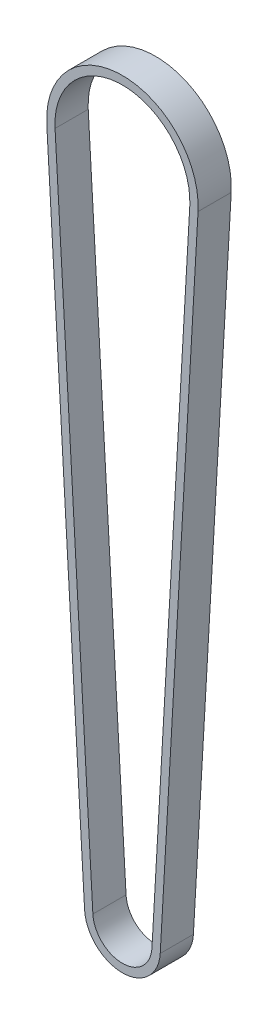
ISO-10303-21;
HEADER;
FILE_DESCRIPTION(('STEP AP214'),'2;1');
FILE_NAME('part.step','',(''),(''),'','','');
FILE_SCHEMA(('AUTOMOTIVE_DESIGN { 1 0 10303 214 1 1 1 1 }'));
ENDSEC;
DATA;
#1=APPLICATION_CONTEXT('core data for automotive mechanical design processes');
#2=APPLICATION_PROTOCOL_DEFINITION('international standard','automotive_design',2000,#1);
#3=PRODUCT_CONTEXT('',#1,'mechanical');
#4=PRODUCT('Part','Part','',(#3));
#5=PRODUCT_RELATED_PRODUCT_CATEGORY('part','',(#4));
#6=PRODUCT_DEFINITION_FORMATION('','',#4);
#7=PRODUCT_DEFINITION_CONTEXT('part definition',#1,'design');
#8=PRODUCT_DEFINITION('design','',#6,#7);
#9=PRODUCT_DEFINITION_SHAPE('','',#8);
#10=(LENGTH_UNIT() NAMED_UNIT(*) SI_UNIT(.MILLI.,.METRE.));
#11=(NAMED_UNIT(*) PLANE_ANGLE_UNIT() SI_UNIT($,.RADIAN.));
#12=(NAMED_UNIT(*) SI_UNIT($,.STERADIAN.) SOLID_ANGLE_UNIT());
#13=UNCERTAINTY_MEASURE_WITH_UNIT(LENGTH_MEASURE(1.E-05),#10,'distance_accuracy_value','');
#14=(GEOMETRIC_REPRESENTATION_CONTEXT(3) GLOBAL_UNCERTAINTY_ASSIGNED_CONTEXT((#13)) GLOBAL_UNIT_ASSIGNED_CONTEXT((#10,
#11,#12)) REPRESENTATION_CONTEXT('',''));
#15=CARTESIAN_POINT('',(0.,0.,0.));
#16=DIRECTION('',(0.,0.,1.));
#17=DIRECTION('',(1.,0.,0.));
#18=AXIS2_PLACEMENT_3D('',#15,#16,#17);
#19=CARTESIAN_POINT('',(0.,-60.,3.));
#20=DIRECTION('',(0.,0.,1.));
#21=DIRECTION('',(1.,0.,0.));
#22=AXIS2_PLACEMENT_3D('',#19,#20,#21);
#23=PLANE('',#22);
#24=CARTESIAN_POINT('',(0.,-60.,3.));
#25=DIRECTION('',(0.,0.,1.));
#26=DIRECTION('',(1.,0.,0.));
#27=AXIS2_PLACEMENT_3D('',#24,#25,#26);
#28=CIRCLE('',#27,6.85);
#29=CARTESIAN_POINT('',(-6.83883050732354,-60.3910208333333,3.));
#30=VERTEX_POINT('',#29);
#31=CARTESIAN_POINT('',(6.83883050732357,-60.3910208333333,3.));
#32=VERTEX_POINT('',#31);
#33=EDGE_CURVE('E163',#30,#32,#28,.T.);
#34=ORIENTED_EDGE('',*,*,#33,.T.);
#35=DIRECTION('',(0.0570833333333333,0.998369417127526,0.));
#36=VECTOR('',#35,1.);
#37=CARTESIAN_POINT('',(6.83883050732357,-60.3910208333333,3.));
#38=LINE('',#37,#36);
#39=CARTESIAN_POINT('',(13.6776610146471,59.2179583333333,3.));
#40=VERTEX_POINT('',#39);
#41=EDGE_CURVE('E166',#32,#40,#38,.T.);
#42=ORIENTED_EDGE('',*,*,#41,.T.);
#43=CARTESIAN_POINT('',(0.,60.,3.));
#44=DIRECTION('',(0.,0.,-1.));
#45=DIRECTION('',(-1.,0.,0.));
#46=AXIS2_PLACEMENT_3D('',#43,#44,#45);
#47=CIRCLE('',#46,13.7);
#48=CARTESIAN_POINT('',(-13.6776610146471,59.2179583333333,3.));
#49=VERTEX_POINT('',#48);
#50=EDGE_CURVE('E169',#49,#40,#47,.T.);
#51=ORIENTED_EDGE('',*,*,#50,.F.);
#52=DIRECTION('',(0.0570833333333333,-0.998369417127526,0.));
#53=VECTOR('',#52,1.);
#54=CARTESIAN_POINT('',(-13.6776610146471,59.2179583333333,3.));
#55=LINE('',#54,#53);
#56=EDGE_CURVE('E172',#49,#30,#55,.T.);
#57=ORIENTED_EDGE('',*,*,#56,.T.);
#58=EDGE_LOOP('',(#34,#42,#51,#57));
#59=FACE_BOUND('',#58,.T.);
#60=DIRECTION('',(0.0570833333333333,0.998369417127526,0.));
#61=VECTOR('',#60,1.);
#62=CARTESIAN_POINT('',(5.34127638163228,-60.3053958333333,3.));
#63=LINE('',#62,#61);
#64=CARTESIAN_POINT('',(5.34127638163228,-60.3053958333333,3.));
#65=VERTEX_POINT('',#64);
#66=CARTESIAN_POINT('',(12.1801068889558,59.3035833333333,3.));
#67=VERTEX_POINT('',#66);
#68=EDGE_CURVE('E132',#65,#67,#63,.T.);
#69=ORIENTED_EDGE('',*,*,#68,.F.);
#70=CARTESIAN_POINT('',(0.,-60.,3.));
#71=DIRECTION('',(0.,0.,1.));
#72=DIRECTION('',(1.,0.,0.));
#73=AXIS2_PLACEMENT_3D('',#70,#71,#72);
#74=CIRCLE('',#73,5.35);
#75=CARTESIAN_POINT('',(-5.34127638163225,-60.3053958333333,3.));
#76=VERTEX_POINT('',#75);
#77=EDGE_CURVE('E124',#76,#65,#74,.T.);
#78=ORIENTED_EDGE('',*,*,#77,.F.);
#79=DIRECTION('',(0.0570833333333334,-0.998369417127526,0.));
#80=VECTOR('',#79,1.);
#81=CARTESIAN_POINT('',(-12.1801068889558,59.3035833333333,3.));
#82=LINE('',#81,#80);
#83=CARTESIAN_POINT('',(-12.1801068889558,59.3035833333333,3.));
#84=VERTEX_POINT('',#83);
#85=EDGE_CURVE('E146',#84,#76,#82,.T.);
#86=ORIENTED_EDGE('',*,*,#85,.F.);
#87=CARTESIAN_POINT('',(0.,60.,3.));
#88=DIRECTION('',(0.,0.,1.));
#89=DIRECTION('',(1.,0.,0.));
#90=AXIS2_PLACEMENT_3D('',#87,#88,#89);
#91=CIRCLE('',#90,12.2);
#92=EDGE_CURVE('E73',#84,#67,#91,.F.);
#93=ORIENTED_EDGE('',*,*,#92,.T.);
#94=EDGE_LOOP('',(#69,#78,#86,#93));
#95=FACE_BOUND('',#94,.T.);
#96=ADVANCED_FACE('F58',(#59,#95),#23,.T.);
#97=CARTESIAN_POINT('',(0.,-60.,-3.));
#98=DIRECTION('',(0.,0.,1.));
#99=DIRECTION('',(1.,0.,0.));
#100=AXIS2_PLACEMENT_3D('',#97,#98,#99);
#101=PLANE('',#100);
#102=CARTESIAN_POINT('',(0.,-60.,-3.));
#103=DIRECTION('',(0.,0.,1.));
#104=DIRECTION('',(1.,0.,0.));
#105=AXIS2_PLACEMENT_3D('',#102,#103,#104);
#106=CIRCLE('',#105,6.85);
#107=CARTESIAN_POINT('',(-6.83883050732354,-60.3910208333333,-3.));
#108=VERTEX_POINT('',#107);
#109=CARTESIAN_POINT('',(6.83883050732357,-60.3910208333333,-3.));
#110=VERTEX_POINT('',#109);
#111=EDGE_CURVE('E139',#108,#110,#106,.T.);
#112=ORIENTED_EDGE('',*,*,#111,.F.);
#113=DIRECTION('',(0.0570833333333333,-0.998369417127526,0.));
#114=VECTOR('',#113,1.);
#115=CARTESIAN_POINT('',(-13.6776610146471,59.2179583333333,-3.));
#116=LINE('',#115,#114);
#117=CARTESIAN_POINT('',(-13.6776610146471,59.2179583333333,-3.));
#118=VERTEX_POINT('',#117);
#119=EDGE_CURVE('E167',#118,#108,#116,.T.);
#120=ORIENTED_EDGE('',*,*,#119,.F.);
#121=CARTESIAN_POINT('',(0.,60.,-3.));
#122=DIRECTION('',(0.,0.,-1.));
#123=DIRECTION('',(-1.,0.,0.));
#124=AXIS2_PLACEMENT_3D('',#121,#122,#123);
#125=CIRCLE('',#124,13.7);
#126=CARTESIAN_POINT('',(13.6776610146471,59.2179583333333,-3.));
#127=VERTEX_POINT('',#126);
#128=EDGE_CURVE('E182',#118,#127,#125,.T.);
#129=ORIENTED_EDGE('',*,*,#128,.T.);
#130=DIRECTION('',(0.0570833333333333,0.998369417127526,0.));
#131=VECTOR('',#130,1.);
#132=CARTESIAN_POINT('',(6.83883050732357,-60.3910208333333,-3.));
#133=LINE('',#132,#131);
#134=EDGE_CURVE('E178',#110,#127,#133,.T.);
#135=ORIENTED_EDGE('',*,*,#134,.F.);
#136=EDGE_LOOP('',(#112,#120,#129,#135));
#137=FACE_BOUND('',#136,.T.);
#138=CARTESIAN_POINT('',(0.,-60.,-3.));
#139=DIRECTION('',(0.,0.,1.));
#140=DIRECTION('',(1.,0.,0.));
#141=AXIS2_PLACEMENT_3D('',#138,#139,#140);
#142=CIRCLE('',#141,5.35);
#143=CARTESIAN_POINT('',(-5.34127638163225,-60.3053958333333,-3.));
#144=VERTEX_POINT('',#143);
#145=CARTESIAN_POINT('',(5.34127638163228,-60.3053958333333,-3.));
#146=VERTEX_POINT('',#145);
#147=EDGE_CURVE('E81',#144,#146,#142,.T.);
#148=ORIENTED_EDGE('',*,*,#147,.T.);
#149=DIRECTION('',(0.0570833333333333,0.998369417127526,0.));
#150=VECTOR('',#149,1.);
#151=CARTESIAN_POINT('',(5.34127638163228,-60.3053958333333,-3.));
#152=LINE('',#151,#150);
#153=CARTESIAN_POINT('',(12.1801068889558,59.3035833333333,-3.));
#154=VERTEX_POINT('',#153);
#155=EDGE_CURVE('E138',#146,#154,#152,.T.);
#156=ORIENTED_EDGE('',*,*,#155,.T.);
#157=CARTESIAN_POINT('',(0.,60.,-3.));
#158=DIRECTION('',(0.,0.,1.));
#159=DIRECTION('',(1.,0.,0.));
#160=AXIS2_PLACEMENT_3D('',#157,#158,#159);
#161=CIRCLE('',#160,12.2);
#162=CARTESIAN_POINT('',(-12.1801068889558,59.3035833333333,-3.));
#163=VERTEX_POINT('',#162);
#164=EDGE_CURVE('E153',#163,#154,#161,.F.);
#165=ORIENTED_EDGE('',*,*,#164,.F.);
#166=DIRECTION('',(0.0570833333333334,-0.998369417127526,0.));
#167=VECTOR('',#166,1.);
#168=CARTESIAN_POINT('',(-12.1801068889558,59.3035833333333,-3.));
#169=LINE('',#168,#167);
#170=EDGE_CURVE('E133',#163,#144,#169,.T.);
#171=ORIENTED_EDGE('',*,*,#170,.T.);
#172=EDGE_LOOP('',(#148,#156,#165,#171));
#173=FACE_BOUND('',#172,.T.);
#174=ADVANCED_FACE('F201',(#137,#173),#101,.F.);
#175=CARTESIAN_POINT('',(0.,-60.,3.));
#176=DIRECTION('',(0.,0.,-1.));
#177=DIRECTION('',(-1.,0.,0.));
#178=AXIS2_PLACEMENT_3D('',#175,#176,#177);
#179=CYLINDRICAL_SURFACE('',#178,6.85);
#180=ORIENTED_EDGE('',*,*,#111,.T.);
#181=DIRECTION('',(0.,0.,-1.));
#182=VECTOR('',#181,1.);
#183=CARTESIAN_POINT('',(6.83883050732357,-60.3910208333333,3.));
#184=LINE('',#183,#182);
#185=EDGE_CURVE('E12',#32,#110,#184,.T.);
#186=ORIENTED_EDGE('',*,*,#185,.F.);
#187=ORIENTED_EDGE('',*,*,#33,.F.);
#188=DIRECTION('',(0.,0.,-1.));
#189=VECTOR('',#188,1.);
#190=CARTESIAN_POINT('',(-6.83883050732354,-60.3910208333333,3.));
#191=LINE('',#190,#189);
#192=EDGE_CURVE('E175',#30,#108,#191,.T.);
#193=ORIENTED_EDGE('',*,*,#192,.T.);
#194=EDGE_LOOP('',(#180,#186,#187,#193));
#195=FACE_BOUND('',#194,.T.);
#196=ADVANCED_FACE('F60',(#195),#179,.T.);
#197=CARTESIAN_POINT('',(6.83883050732357,-60.3910208333333,3.));
#198=DIRECTION('',(-0.998369417127526,0.0570833333333333,0.));
#199=DIRECTION('',(-0.0570833333333333,-0.998369417127526,0.));
#200=AXIS2_PLACEMENT_3D('',#197,#198,#199);
#201=PLANE('',#200);
#202=ORIENTED_EDGE('',*,*,#134,.T.);
#203=DIRECTION('',(0.,0.,-1.));
#204=VECTOR('',#203,1.);
#205=CARTESIAN_POINT('',(13.6776610146471,59.2179583333333,3.));
#206=LINE('',#205,#204);
#207=EDGE_CURVE('E66',#40,#127,#206,.T.);
#208=ORIENTED_EDGE('',*,*,#207,.F.);
#209=ORIENTED_EDGE('',*,*,#41,.F.);
#210=ORIENTED_EDGE('',*,*,#185,.T.);
#211=EDGE_LOOP('',(#202,#208,#209,#210));
#212=FACE_BOUND('',#211,.T.);
#213=ADVANCED_FACE('F196',(#212),#201,.F.);
#214=CARTESIAN_POINT('',(0.,60.,3.));
#215=DIRECTION('',(0.,0.,-1.));
#216=DIRECTION('',(-1.,0.,0.));
#217=AXIS2_PLACEMENT_3D('',#214,#215,#216);
#218=CYLINDRICAL_SURFACE('',#217,13.7);
#219=ORIENTED_EDGE('',*,*,#128,.F.);
#220=DIRECTION('',(0.,0.,-1.));
#221=VECTOR('',#220,1.);
#222=CARTESIAN_POINT('',(-13.6776610146471,59.2179583333333,3.));
#223=LINE('',#222,#221);
#224=EDGE_CURVE('E189',#49,#118,#223,.T.);
#225=ORIENTED_EDGE('',*,*,#224,.F.);
#226=ORIENTED_EDGE('',*,*,#50,.T.);
#227=ORIENTED_EDGE('',*,*,#207,.T.);
#228=EDGE_LOOP('',(#219,#225,#226,#227));
#229=FACE_BOUND('',#228,.T.);
#230=ADVANCED_FACE('F193',(#229),#218,.T.);
#231=CARTESIAN_POINT('',(-13.6776610146471,59.2179583333333,3.));
#232=DIRECTION('',(0.998369417127526,0.0570833333333333,0.));
#233=DIRECTION('',(-0.0570833333333334,0.998369417127526,0.));
#234=AXIS2_PLACEMENT_3D('',#231,#232,#233);
#235=PLANE('',#234);
#236=ORIENTED_EDGE('',*,*,#119,.T.);
#237=ORIENTED_EDGE('',*,*,#192,.F.);
#238=ORIENTED_EDGE('',*,*,#56,.F.);
#239=ORIENTED_EDGE('',*,*,#224,.T.);
#240=EDGE_LOOP('',(#236,#237,#238,#239));
#241=FACE_BOUND('',#240,.T.);
#242=ADVANCED_FACE('F205',(#241),#235,.F.);
#243=CARTESIAN_POINT('',(0.,-60.,3.));
#244=DIRECTION('',(0.,0.,-1.));
#245=DIRECTION('',(-1.,0.,0.));
#246=AXIS2_PLACEMENT_3D('',#243,#244,#245);
#247=CYLINDRICAL_SURFACE('',#246,5.35);
#248=ORIENTED_EDGE('',*,*,#147,.F.);
#249=DIRECTION('',(0.,0.,-1.));
#250=VECTOR('',#249,1.);
#251=CARTESIAN_POINT('',(-5.34127638163225,-60.3053958333333,3.));
#252=LINE('',#251,#250);
#253=EDGE_CURVE('E128',#76,#144,#252,.T.);
#254=ORIENTED_EDGE('',*,*,#253,.F.);
#255=ORIENTED_EDGE('',*,*,#77,.T.);
#256=DIRECTION('',(0.,0.,-1.));
#257=VECTOR('',#256,1.);
#258=CARTESIAN_POINT('',(5.34127638163228,-60.3053958333333,3.));
#259=LINE('',#258,#257);
#260=EDGE_CURVE('E127',#65,#146,#259,.T.);
#261=ORIENTED_EDGE('',*,*,#260,.T.);
#262=EDGE_LOOP('',(#248,#254,#255,#261));
#263=FACE_BOUND('',#262,.T.);
#264=ADVANCED_FACE('F126',(#263),#247,.F.);
#265=CARTESIAN_POINT('',(5.34127638163228,-60.3053958333333,3.));
#266=DIRECTION('',(-0.998369417127526,0.0570833333333333,0.));
#267=DIRECTION('',(-0.0570833333333333,-0.998369417127526,0.));
#268=AXIS2_PLACEMENT_3D('',#265,#266,#267);
#269=PLANE('',#268);
#270=ORIENTED_EDGE('',*,*,#155,.F.);
#271=ORIENTED_EDGE('',*,*,#260,.F.);
#272=ORIENTED_EDGE('',*,*,#68,.T.);
#273=DIRECTION('',(0.,0.,-1.));
#274=VECTOR('',#273,1.);
#275=CARTESIAN_POINT('',(12.1801068889558,59.3035833333333,3.));
#276=LINE('',#275,#274);
#277=EDGE_CURVE('E140',#67,#154,#276,.T.);
#278=ORIENTED_EDGE('',*,*,#277,.T.);
#279=EDGE_LOOP('',(#270,#271,#272,#278));
#280=FACE_BOUND('',#279,.T.);
#281=ADVANCED_FACE('F136',(#280),#269,.T.);
#282=CARTESIAN_POINT('',(0.,60.,3.));
#283=DIRECTION('',(0.,0.,-1.));
#284=DIRECTION('',(-1.,0.,0.));
#285=AXIS2_PLACEMENT_3D('',#282,#283,#284);
#286=CYLINDRICAL_SURFACE('',#285,12.2);
#287=ORIENTED_EDGE('',*,*,#164,.T.);
#288=ORIENTED_EDGE('',*,*,#277,.F.);
#289=ORIENTED_EDGE('',*,*,#92,.F.);
#290=DIRECTION('',(0.,0.,-1.));
#291=VECTOR('',#290,1.);
#292=CARTESIAN_POINT('',(-12.1801068889558,59.3035833333333,3.));
#293=LINE('',#292,#291);
#294=EDGE_CURVE('E160',#84,#163,#293,.T.);
#295=ORIENTED_EDGE('',*,*,#294,.T.);
#296=EDGE_LOOP('',(#287,#288,#289,#295));
#297=FACE_BOUND('',#296,.T.);
#298=ADVANCED_FACE('F268',(#297),#286,.F.);
#299=CARTESIAN_POINT('',(-12.1801068889558,59.3035833333333,3.));
#300=DIRECTION('',(0.998369417127526,0.0570833333333334,0.));
#301=DIRECTION('',(-0.0570833333333334,0.998369417127526,0.));
#302=AXIS2_PLACEMENT_3D('',#299,#300,#301);
#303=PLANE('',#302);
#304=ORIENTED_EDGE('',*,*,#170,.F.);
#305=ORIENTED_EDGE('',*,*,#294,.F.);
#306=ORIENTED_EDGE('',*,*,#85,.T.);
#307=ORIENTED_EDGE('',*,*,#253,.T.);
#308=EDGE_LOOP('',(#304,#305,#306,#307));
#309=FACE_BOUND('',#308,.T.);
#310=ADVANCED_FACE('F275',(#309),#303,.T.);
#311=CLOSED_SHELL('',(#96,#174,#196,#213,#230,#242,#264,#281,#298,#310));
#312=MANIFOLD_SOLID_BREP('B2',#311);
#313=ADVANCED_BREP_SHAPE_REPRESENTATION('',(#18,#312),#14);
#314=SHAPE_DEFINITION_REPRESENTATION(#9,#313);
ENDSEC;
END-ISO-10303-21;
